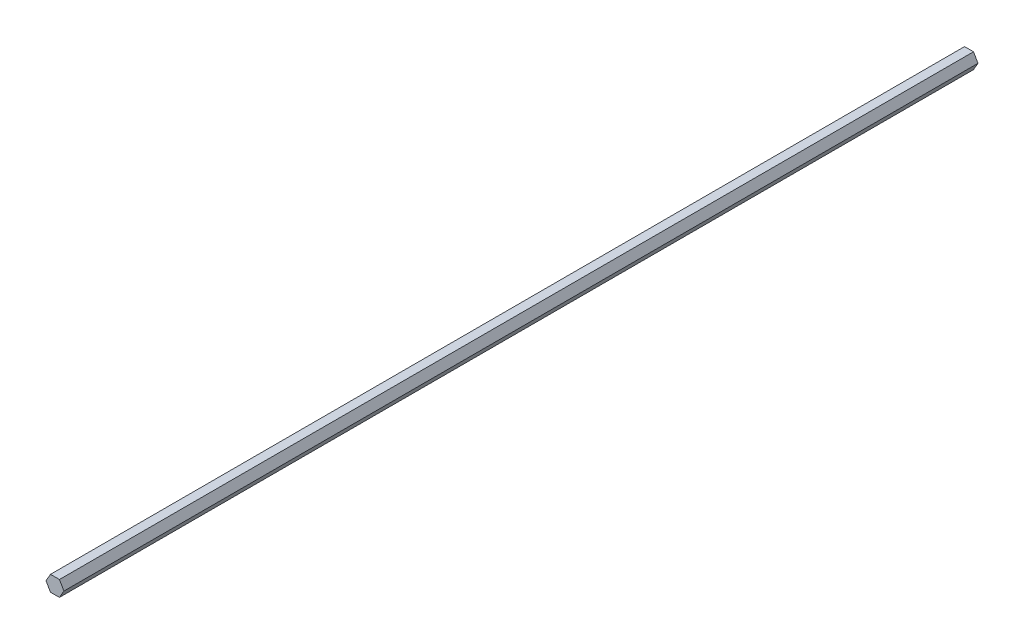
ISO-10303-21;
HEADER;
FILE_DESCRIPTION(('STEP AP214'),'2;1');
FILE_NAME('part.step','',(''),(''),'','','');
FILE_SCHEMA(('AUTOMOTIVE_DESIGN { 1 0 10303 214 1 1 1 1 }'));
ENDSEC;
DATA;
#1=APPLICATION_CONTEXT('core data for automotive mechanical design processes');
#2=APPLICATION_PROTOCOL_DEFINITION('international standard','automotive_design',2000,#1);
#3=PRODUCT_CONTEXT('',#1,'mechanical');
#4=PRODUCT('Part','Part','',(#3));
#5=PRODUCT_RELATED_PRODUCT_CATEGORY('part','',(#4));
#6=PRODUCT_DEFINITION_FORMATION('','',#4);
#7=PRODUCT_DEFINITION_CONTEXT('part definition',#1,'design');
#8=PRODUCT_DEFINITION('design','',#6,#7);
#9=PRODUCT_DEFINITION_SHAPE('','',#8);
#10=(LENGTH_UNIT() NAMED_UNIT(*) SI_UNIT(.MILLI.,.METRE.));
#11=(NAMED_UNIT(*) PLANE_ANGLE_UNIT() SI_UNIT($,.RADIAN.));
#12=(NAMED_UNIT(*) SI_UNIT($,.STERADIAN.) SOLID_ANGLE_UNIT());
#13=UNCERTAINTY_MEASURE_WITH_UNIT(LENGTH_MEASURE(1.E-05),#10,'distance_accuracy_value','');
#14=(GEOMETRIC_REPRESENTATION_CONTEXT(3) GLOBAL_UNCERTAINTY_ASSIGNED_CONTEXT((#13)) GLOBAL_UNIT_ASSIGNED_CONTEXT((#10,
#11,#12)) REPRESENTATION_CONTEXT('',''));
#15=CARTESIAN_POINT('',(0.,0.,0.));
#16=DIRECTION('',(0.,0.,1.));
#17=DIRECTION('',(1.,0.,0.));
#18=AXIS2_PLACEMENT_3D('',#15,#16,#17);
#19=CARTESIAN_POINT('',(-18.6849693586564,22.3856171512014,750.));
#20=DIRECTION('',(-0.866025403784438,-0.500000000000001,0.));
#21=DIRECTION('',(0.500000000000001,-0.866025403784438,0.));
#22=AXIS2_PLACEMENT_3D('',#19,#20,#21);
#23=PLANE('',#22);
#24=DIRECTION('',(-0.500000000000001,0.866025403784438,0.));
#25=VECTOR('',#24,1.);
#26=CARTESIAN_POINT('',(-18.6849693586564,22.3856171512014,0.));
#27=LINE('',#26,#25);
#28=CARTESIAN_POINT('',(-18.6849693586564,22.3856171512014,0.));
#29=VERTEX_POINT('',#28);
#30=CARTESIAN_POINT('',(-22.3626905733943,28.7556171512014,0.));
#31=VERTEX_POINT('',#30);
#32=EDGE_CURVE('E117',#29,#31,#27,.T.);
#33=ORIENTED_EDGE('',*,*,#32,.T.);
#34=DIRECTION('',(0.,0.,-1.));
#35=VECTOR('',#34,1.);
#36=CARTESIAN_POINT('',(-22.3626905733943,28.7556171512014,750.));
#37=LINE('',#36,#35);
#38=CARTESIAN_POINT('',(-22.3626905733943,28.7556171512014,750.));
#39=VERTEX_POINT('',#38);
#40=EDGE_CURVE('E11',#39,#31,#37,.T.);
#41=ORIENTED_EDGE('',*,*,#40,.F.);
#42=DIRECTION('',(-0.500000000000001,0.866025403784438,0.));
#43=VECTOR('',#42,1.);
#44=CARTESIAN_POINT('',(-18.6849693586564,22.3856171512014,750.));
#45=LINE('',#44,#43);
#46=CARTESIAN_POINT('',(-18.6849693586564,22.3856171512014,750.));
#47=VERTEX_POINT('',#46);
#48=EDGE_CURVE('E127',#47,#39,#45,.T.);
#49=ORIENTED_EDGE('',*,*,#48,.F.);
#50=DIRECTION('',(0.,0.,-1.));
#51=VECTOR('',#50,1.);
#52=CARTESIAN_POINT('',(-18.6849693586564,22.3856171512014,750.));
#53=LINE('',#52,#51);
#54=EDGE_CURVE('E113',#47,#29,#53,.T.);
#55=ORIENTED_EDGE('',*,*,#54,.T.);
#56=EDGE_LOOP('',(#33,#41,#49,#55));
#57=FACE_BOUND('',#56,.T.);
#58=ADVANCED_FACE('F33',(#57),#23,.F.);
#59=CARTESIAN_POINT('',(-22.3626905733943,28.7556171512014,750.));
#60=DIRECTION('',(0.,-1.,0.));
#61=DIRECTION('',(0.,0.,-1.));
#62=AXIS2_PLACEMENT_3D('',#59,#60,#61);
#63=PLANE('',#62);
#64=DIRECTION('',(-1.,0.,0.));
#65=VECTOR('',#64,1.);
#66=CARTESIAN_POINT('',(-22.3626905733943,28.7556171512014,0.));
#67=LINE('',#66,#65);
#68=CARTESIAN_POINT('',(-29.7181330028701,28.7556171512014,0.));
#69=VERTEX_POINT('',#68);
#70=EDGE_CURVE('E120',#31,#69,#67,.T.);
#71=ORIENTED_EDGE('',*,*,#70,.T.);
#72=DIRECTION('',(0.,0.,-1.));
#73=VECTOR('',#72,1.);
#74=CARTESIAN_POINT('',(-29.7181330028701,28.7556171512014,750.));
#75=LINE('',#74,#73);
#76=CARTESIAN_POINT('',(-29.7181330028701,28.7556171512014,750.));
#77=VERTEX_POINT('',#76);
#78=EDGE_CURVE('E41',#77,#69,#75,.T.);
#79=ORIENTED_EDGE('',*,*,#78,.F.);
#80=DIRECTION('',(-1.,0.,0.));
#81=VECTOR('',#80,1.);
#82=CARTESIAN_POINT('',(-22.3626905733943,28.7556171512014,750.));
#83=LINE('',#82,#81);
#84=EDGE_CURVE('E86',#39,#77,#83,.T.);
#85=ORIENTED_EDGE('',*,*,#84,.F.);
#86=ORIENTED_EDGE('',*,*,#40,.T.);
#87=EDGE_LOOP('',(#71,#79,#85,#86));
#88=FACE_BOUND('',#87,.T.);
#89=ADVANCED_FACE('F151',(#88),#63,.F.);
#90=CARTESIAN_POINT('',(-29.7181330028701,28.7556171512014,750.));
#91=DIRECTION('',(0.866025403784438,-0.500000000000001,0.));
#92=DIRECTION('',(0.500000000000001,0.866025403784438,0.));
#93=AXIS2_PLACEMENT_3D('',#90,#91,#92);
#94=PLANE('',#93);
#95=DIRECTION('',(-0.500000000000001,-0.866025403784438,0.));
#96=VECTOR('',#95,1.);
#97=CARTESIAN_POINT('',(-29.7181330028701,28.7556171512014,0.));
#98=LINE('',#97,#96);
#99=CARTESIAN_POINT('',(-33.3958542176081,22.3856171512014,0.));
#100=VERTEX_POINT('',#99);
#101=EDGE_CURVE('E122',#69,#100,#98,.T.);
#102=ORIENTED_EDGE('',*,*,#101,.T.);
#103=DIRECTION('',(0.,0.,-1.));
#104=VECTOR('',#103,1.);
#105=CARTESIAN_POINT('',(-33.3958542176081,22.3856171512014,750.));
#106=LINE('',#105,#104);
#107=CARTESIAN_POINT('',(-33.3958542176081,22.3856171512014,750.));
#108=VERTEX_POINT('',#107);
#109=EDGE_CURVE('E108',#108,#100,#106,.T.);
#110=ORIENTED_EDGE('',*,*,#109,.F.);
#111=DIRECTION('',(-0.500000000000001,-0.866025403784438,0.));
#112=VECTOR('',#111,1.);
#113=CARTESIAN_POINT('',(-29.7181330028701,28.7556171512014,750.));
#114=LINE('',#113,#112);
#115=EDGE_CURVE('E99',#77,#108,#114,.T.);
#116=ORIENTED_EDGE('',*,*,#115,.F.);
#117=ORIENTED_EDGE('',*,*,#78,.T.);
#118=EDGE_LOOP('',(#102,#110,#116,#117));
#119=FACE_BOUND('',#118,.T.);
#120=ADVANCED_FACE('F133',(#119),#94,.F.);
#121=CARTESIAN_POINT('',(-33.3958542176081,22.3856171512014,750.));
#122=DIRECTION('',(0.866025403784438,0.500000000000001,0.));
#123=DIRECTION('',(-0.500000000000001,0.866025403784438,0.));
#124=AXIS2_PLACEMENT_3D('',#121,#122,#123);
#125=PLANE('',#124);
#126=DIRECTION('',(0.500000000000001,-0.866025403784438,0.));
#127=VECTOR('',#126,1.);
#128=CARTESIAN_POINT('',(-33.3958542176081,22.3856171512014,0.));
#129=LINE('',#128,#127);
#130=CARTESIAN_POINT('',(-29.7181330028701,16.0156171512013,0.));
#131=VERTEX_POINT('',#130);
#132=EDGE_CURVE('E107',#100,#131,#129,.T.);
#133=ORIENTED_EDGE('',*,*,#132,.T.);
#134=DIRECTION('',(0.,0.,-1.));
#135=VECTOR('',#134,1.);
#136=CARTESIAN_POINT('',(-29.7181330028701,16.0156171512013,750.));
#137=LINE('',#136,#135);
#138=CARTESIAN_POINT('',(-29.7181330028701,16.0156171512013,750.));
#139=VERTEX_POINT('',#138);
#140=EDGE_CURVE('E104',#139,#131,#137,.T.);
#141=ORIENTED_EDGE('',*,*,#140,.F.);
#142=DIRECTION('',(0.500000000000001,-0.866025403784438,0.));
#143=VECTOR('',#142,1.);
#144=CARTESIAN_POINT('',(-33.3958542176081,22.3856171512014,750.));
#145=LINE('',#144,#143);
#146=EDGE_CURVE('E93',#108,#139,#145,.T.);
#147=ORIENTED_EDGE('',*,*,#146,.F.);
#148=ORIENTED_EDGE('',*,*,#109,.T.);
#149=EDGE_LOOP('',(#133,#141,#147,#148));
#150=FACE_BOUND('',#149,.T.);
#151=ADVANCED_FACE('F105',(#150),#125,.F.);
#152=CARTESIAN_POINT('',(-29.7181330028701,16.0156171512013,750.));
#153=DIRECTION('',(0.,1.,0.));
#154=DIRECTION('',(0.,0.,1.));
#155=AXIS2_PLACEMENT_3D('',#152,#153,#154);
#156=PLANE('',#155);
#157=DIRECTION('',(1.,0.,0.));
#158=VECTOR('',#157,1.);
#159=CARTESIAN_POINT('',(-29.7181330028701,16.0156171512013,0.));
#160=LINE('',#159,#158);
#161=CARTESIAN_POINT('',(-22.3626905733943,16.0156171512013,0.));
#162=VERTEX_POINT('',#161);
#163=EDGE_CURVE('E72',#131,#162,#160,.T.);
#164=ORIENTED_EDGE('',*,*,#163,.T.);
#165=DIRECTION('',(0.,0.,-1.));
#166=VECTOR('',#165,1.);
#167=CARTESIAN_POINT('',(-22.3626905733943,16.0156171512013,750.));
#168=LINE('',#167,#166);
#169=CARTESIAN_POINT('',(-22.3626905733943,16.0156171512013,750.));
#170=VERTEX_POINT('',#169);
#171=EDGE_CURVE('E109',#170,#162,#168,.T.);
#172=ORIENTED_EDGE('',*,*,#171,.F.);
#173=DIRECTION('',(1.,0.,0.));
#174=VECTOR('',#173,1.);
#175=CARTESIAN_POINT('',(-29.7181330028701,16.0156171512013,750.));
#176=LINE('',#175,#174);
#177=EDGE_CURVE('E97',#139,#170,#176,.T.);
#178=ORIENTED_EDGE('',*,*,#177,.F.);
#179=ORIENTED_EDGE('',*,*,#140,.T.);
#180=EDGE_LOOP('',(#164,#172,#178,#179));
#181=FACE_BOUND('',#180,.T.);
#182=ADVANCED_FACE('F111',(#181),#156,.F.);
#183=CARTESIAN_POINT('',(-22.3626905733943,16.0156171512013,750.));
#184=DIRECTION('',(-0.866025403784439,0.5,0.));
#185=DIRECTION('',(-0.5,-0.866025403784439,0.));
#186=AXIS2_PLACEMENT_3D('',#183,#184,#185);
#187=PLANE('',#186);
#188=DIRECTION('',(0.5,0.866025403784439,0.));
#189=VECTOR('',#188,1.);
#190=CARTESIAN_POINT('',(-22.3626905733943,16.0156171512013,0.));
#191=LINE('',#190,#189);
#192=EDGE_CURVE('E78',#162,#29,#191,.T.);
#193=ORIENTED_EDGE('',*,*,#192,.T.);
#194=ORIENTED_EDGE('',*,*,#54,.F.);
#195=DIRECTION('',(0.5,0.866025403784439,0.));
#196=VECTOR('',#195,1.);
#197=CARTESIAN_POINT('',(-22.3626905733943,16.0156171512013,750.));
#198=LINE('',#197,#196);
#199=EDGE_CURVE('E49',#170,#47,#198,.T.);
#200=ORIENTED_EDGE('',*,*,#199,.F.);
#201=ORIENTED_EDGE('',*,*,#171,.T.);
#202=EDGE_LOOP('',(#193,#194,#200,#201));
#203=FACE_BOUND('',#202,.T.);
#204=ADVANCED_FACE('F140',(#203),#187,.F.);
#205=CARTESIAN_POINT('',(0.,0.,750.));
#206=DIRECTION('',(0.,0.,1.));
#207=DIRECTION('',(1.,0.,0.));
#208=AXIS2_PLACEMENT_3D('',#205,#206,#207);
#209=PLANE('',#208);
#210=ORIENTED_EDGE('',*,*,#48,.T.);
#211=ORIENTED_EDGE('',*,*,#84,.T.);
#212=ORIENTED_EDGE('',*,*,#115,.T.);
#213=ORIENTED_EDGE('',*,*,#146,.T.);
#214=ORIENTED_EDGE('',*,*,#177,.T.);
#215=ORIENTED_EDGE('',*,*,#199,.T.);
#216=EDGE_LOOP('',(#210,#211,#212,#213,#214,#215));
#217=FACE_BOUND('',#216,.T.);
#218=ADVANCED_FACE('F95',(#217),#209,.T.);
#219=CARTESIAN_POINT('',(0.,0.,0.));
#220=DIRECTION('',(0.,0.,1.));
#221=DIRECTION('',(1.,0.,0.));
#222=AXIS2_PLACEMENT_3D('',#219,#220,#221);
#223=PLANE('',#222);
#224=ORIENTED_EDGE('',*,*,#32,.F.);
#225=ORIENTED_EDGE('',*,*,#192,.F.);
#226=ORIENTED_EDGE('',*,*,#163,.F.);
#227=ORIENTED_EDGE('',*,*,#132,.F.);
#228=ORIENTED_EDGE('',*,*,#101,.F.);
#229=ORIENTED_EDGE('',*,*,#70,.F.);
#230=EDGE_LOOP('',(#224,#225,#226,#227,#228,#229));
#231=FACE_BOUND('',#230,.T.);
#232=ADVANCED_FACE('F136',(#231),#223,.F.);
#233=CLOSED_SHELL('',(#58,#89,#120,#151,#182,#204,#218,#232));
#234=MANIFOLD_SOLID_BREP('B2',#233);
#235=ADVANCED_BREP_SHAPE_REPRESENTATION('',(#18,#234),#14);
#236=SHAPE_DEFINITION_REPRESENTATION(#9,#235);
ENDSEC;
END-ISO-10303-21;
